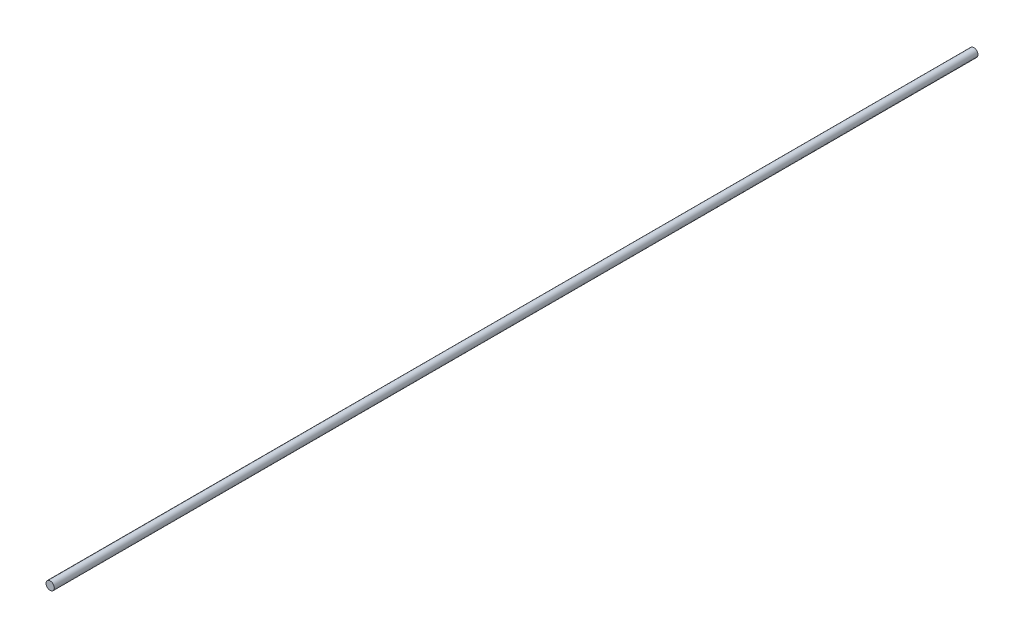
ISO-10303-21;
HEADER;
FILE_DESCRIPTION(('STEP AP214'),'2;1');
FILE_NAME('part.step','',(''),(''),'','','');
FILE_SCHEMA(('AUTOMOTIVE_DESIGN { 1 0 10303 214 1 1 1 1 }'));
ENDSEC;
DATA;
#1=APPLICATION_CONTEXT('core data for automotive mechanical design processes');
#2=APPLICATION_PROTOCOL_DEFINITION('international standard','automotive_design',2000,#1);
#3=PRODUCT_CONTEXT('',#1,'mechanical');
#4=PRODUCT('Part','Part','',(#3));
#5=PRODUCT_RELATED_PRODUCT_CATEGORY('part','',(#4));
#6=PRODUCT_DEFINITION_FORMATION('','',#4);
#7=PRODUCT_DEFINITION_CONTEXT('part definition',#1,'design');
#8=PRODUCT_DEFINITION('design','',#6,#7);
#9=PRODUCT_DEFINITION_SHAPE('','',#8);
#10=(LENGTH_UNIT() NAMED_UNIT(*) SI_UNIT(.MILLI.,.METRE.));
#11=(NAMED_UNIT(*) PLANE_ANGLE_UNIT() SI_UNIT($,.RADIAN.));
#12=(NAMED_UNIT(*) SI_UNIT($,.STERADIAN.) SOLID_ANGLE_UNIT());
#13=UNCERTAINTY_MEASURE_WITH_UNIT(LENGTH_MEASURE(1.E-05),#10,'distance_accuracy_value','');
#14=(GEOMETRIC_REPRESENTATION_CONTEXT(3) GLOBAL_UNCERTAINTY_ASSIGNED_CONTEXT((#13)) GLOBAL_UNIT_ASSIGNED_CONTEXT((#10,
#11,#12)) REPRESENTATION_CONTEXT('',''));
#15=CARTESIAN_POINT('',(0.,0.,0.));
#16=DIRECTION('',(0.,0.,1.));
#17=DIRECTION('',(1.,0.,0.));
#18=AXIS2_PLACEMENT_3D('',#15,#16,#17);
#19=CARTESIAN_POINT('',(0.,0.,690.));
#20=DIRECTION('',(0.,0.,-1.));
#21=DIRECTION('',(-1.,0.,0.));
#22=AXIS2_PLACEMENT_3D('',#19,#20,#21);
#23=CYLINDRICAL_SURFACE('',#22,3.1);
#24=CARTESIAN_POINT('',(0.,0.,690.));
#25=DIRECTION('',(0.,0.,1.));
#26=DIRECTION('',(1.,0.,0.));
#27=AXIS2_PLACEMENT_3D('',#24,#25,#26);
#28=CIRCLE('',#27,3.1);
#29=CARTESIAN_POINT('',(3.1,0.,690.));
#30=VERTEX_POINT('',#29);
#31=EDGE_CURVE('E10',#30,#30,#28,.T.);
#32=ORIENTED_EDGE('',*,*,#31,.F.);
#33=EDGE_LOOP('',(#32));
#34=FACE_BOUND('',#33,.T.);
#35=CARTESIAN_POINT('',(0.,0.,0.));
#36=DIRECTION('',(0.,0.,1.));
#37=DIRECTION('',(1.,0.,0.));
#38=AXIS2_PLACEMENT_3D('',#35,#36,#37);
#39=CIRCLE('',#38,3.1);
#40=CARTESIAN_POINT('',(3.1,0.,0.));
#41=VERTEX_POINT('',#40);
#42=EDGE_CURVE('E33',#41,#41,#39,.T.);
#43=ORIENTED_EDGE('',*,*,#42,.T.);
#44=EDGE_LOOP('',(#43));
#45=FACE_BOUND('',#44,.T.);
#46=ADVANCED_FACE('F30',(#34,#45),#23,.T.);
#47=CARTESIAN_POINT('',(0.,0.,690.));
#48=DIRECTION('',(0.,0.,1.));
#49=DIRECTION('',(1.,0.,0.));
#50=AXIS2_PLACEMENT_3D('',#47,#48,#49);
#51=PLANE('',#50);
#52=ORIENTED_EDGE('',*,*,#31,.T.);
#53=EDGE_LOOP('',(#52));
#54=FACE_BOUND('',#53,.T.);
#55=ADVANCED_FACE('F45',(#54),#51,.T.);
#56=CARTESIAN_POINT('',(0.,0.,0.));
#57=DIRECTION('',(0.,0.,1.));
#58=DIRECTION('',(1.,0.,0.));
#59=AXIS2_PLACEMENT_3D('',#56,#57,#58);
#60=PLANE('',#59);
#61=ORIENTED_EDGE('',*,*,#42,.F.);
#62=EDGE_LOOP('',(#61));
#63=FACE_BOUND('',#62,.T.);
#64=ADVANCED_FACE('F43',(#63),#60,.F.);
#65=CLOSED_SHELL('',(#46,#55,#64));
#66=MANIFOLD_SOLID_BREP('B2',#65);
#67=ADVANCED_BREP_SHAPE_REPRESENTATION('',(#18,#66),#14);
#68=SHAPE_DEFINITION_REPRESENTATION(#9,#67);
ENDSEC;
END-ISO-10303-21;
